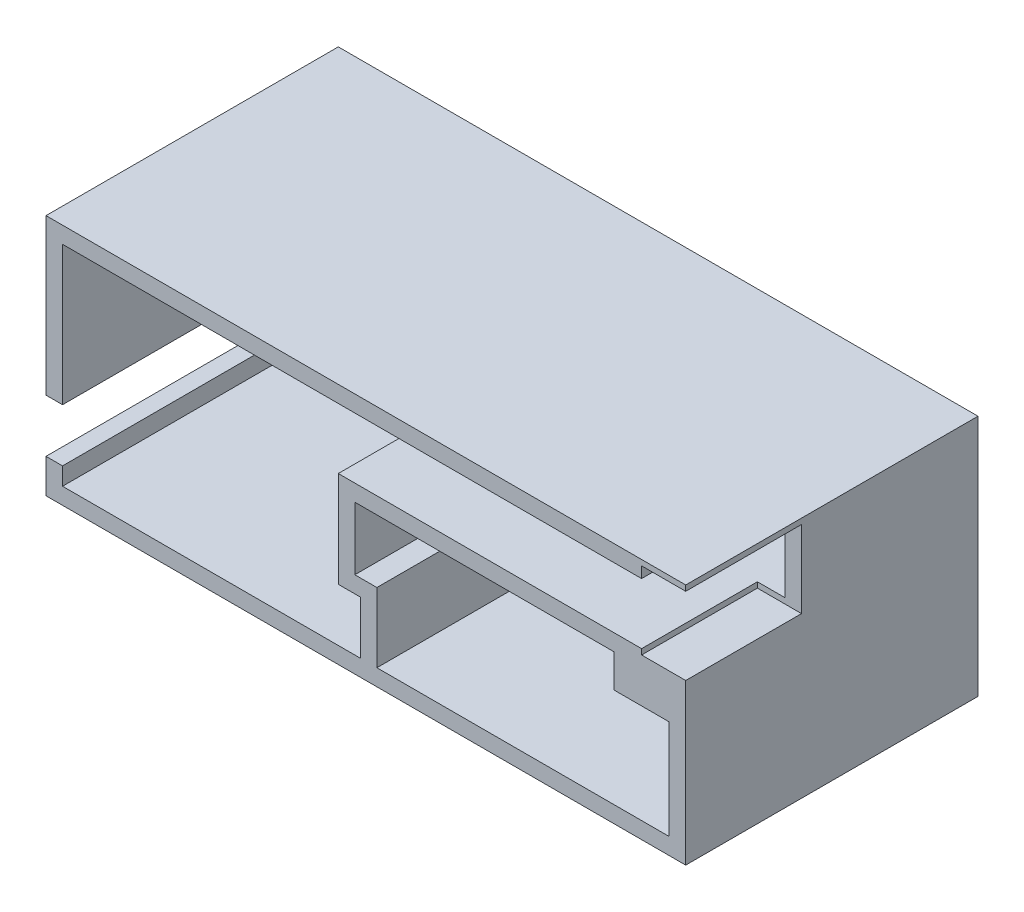
ISO-10303-21;
HEADER;
FILE_DESCRIPTION(('STEP AP214'),'2;1');
FILE_NAME('part.step','',(''),(''),'','','');
FILE_SCHEMA(('AUTOMOTIVE_DESIGN { 1 0 10303 214 1 1 1 1 }'));
ENDSEC;
DATA;
#1=APPLICATION_CONTEXT('core data for automotive mechanical design processes');
#2=APPLICATION_PROTOCOL_DEFINITION('international standard','automotive_design',2000,#1);
#3=PRODUCT_CONTEXT('',#1,'mechanical');
#4=PRODUCT('Part','Part','',(#3));
#5=PRODUCT_RELATED_PRODUCT_CATEGORY('part','',(#4));
#6=PRODUCT_DEFINITION_FORMATION('','',#4);
#7=PRODUCT_DEFINITION_CONTEXT('part definition',#1,'design');
#8=PRODUCT_DEFINITION('design','',#6,#7);
#9=PRODUCT_DEFINITION_SHAPE('','',#8);
#10=(LENGTH_UNIT() NAMED_UNIT(*) SI_UNIT(.MILLI.,.METRE.));
#11=(NAMED_UNIT(*) PLANE_ANGLE_UNIT() SI_UNIT($,.RADIAN.));
#12=(NAMED_UNIT(*) SI_UNIT($,.STERADIAN.) SOLID_ANGLE_UNIT());
#13=UNCERTAINTY_MEASURE_WITH_UNIT(LENGTH_MEASURE(1.E-05),#10,'distance_accuracy_value','');
#14=(GEOMETRIC_REPRESENTATION_CONTEXT(3) GLOBAL_UNCERTAINTY_ASSIGNED_CONTEXT((#13)) GLOBAL_UNIT_ASSIGNED_CONTEXT((#10,
#11,#12)) REPRESENTATION_CONTEXT('',''));
#15=CARTESIAN_POINT('',(0.,0.,0.));
#16=DIRECTION('',(0.,0.,1.));
#17=DIRECTION('',(1.,0.,0.));
#18=AXIS2_PLACEMENT_3D('',#15,#16,#17);
#19=CARTESIAN_POINT('',(0.,0.,26.5));
#20=DIRECTION('',(0.,0.,1.));
#21=DIRECTION('',(1.,0.,0.));
#22=AXIS2_PLACEMENT_3D('',#19,#20,#21);
#23=PLANE('',#22);
#24=DIRECTION('',(1.,0.,0.));
#25=VECTOR('',#24,1.);
#26=CARTESIAN_POINT('',(34.718487394958,21.5,26.5));
#27=LINE('',#26,#25);
#28=CARTESIAN_POINT('',(34.718487394958,21.5,26.5));
#29=VERTEX_POINT('',#28);
#30=CARTESIAN_POINT('',(38.718487394958,21.5,26.5));
#31=VERTEX_POINT('',#30);
#32=EDGE_CURVE('E269',#29,#31,#27,.T.);
#33=ORIENTED_EDGE('',*,*,#32,.T.);
#34=DIRECTION('',(0.,1.,0.));
#35=VECTOR('',#34,1.);
#36=CARTESIAN_POINT('',(38.718487394958,0.,26.5));
#37=LINE('',#36,#35);
#38=CARTESIAN_POINT('',(38.718487394958,22.,26.5));
#39=VERTEX_POINT('',#38);
#40=EDGE_CURVE('E412',#31,#39,#37,.T.);
#41=ORIENTED_EDGE('',*,*,#40,.T.);
#42=DIRECTION('',(-1.,0.,0.));
#43=VECTOR('',#42,1.);
#44=CARTESIAN_POINT('',(38.718487394958,22.,26.5));
#45=LINE('',#44,#43);
#46=CARTESIAN_POINT('',(-19.281512605042,22.,26.5));
#47=VERTEX_POINT('',#46);
#48=EDGE_CURVE('E403',#39,#47,#45,.T.);
#49=ORIENTED_EDGE('',*,*,#48,.T.);
#50=DIRECTION('',(0.,-1.,0.));
#51=VECTOR('',#50,1.);
#52=CARTESIAN_POINT('',(-19.281512605042,22.,26.5));
#53=LINE('',#52,#51);
#54=CARTESIAN_POINT('',(-19.281512605042,7.9,26.5));
#55=VERTEX_POINT('',#54);
#56=EDGE_CURVE('E407',#47,#55,#53,.T.);
#57=ORIENTED_EDGE('',*,*,#56,.T.);
#58=DIRECTION('',(-1.,0.,0.));
#59=VECTOR('',#58,1.);
#60=CARTESIAN_POINT('',(-14.281512605042,7.9,26.5));
#61=LINE('',#60,#59);
#62=CARTESIAN_POINT('',(-17.781512605042,7.9,26.5));
#63=VERTEX_POINT('',#62);
#64=EDGE_CURVE('E280',#63,#55,#61,.T.);
#65=ORIENTED_EDGE('',*,*,#64,.F.);
#66=DIRECTION('',(0.,-1.,0.));
#67=VECTOR('',#66,1.);
#68=CARTESIAN_POINT('',(-17.781512605042,20.5,26.5));
#69=LINE('',#68,#67);
#70=CARTESIAN_POINT('',(-17.781512605042,20.5,26.5));
#71=VERTEX_POINT('',#70);
#72=EDGE_CURVE('E351',#71,#63,#69,.T.);
#73=ORIENTED_EDGE('',*,*,#72,.F.);
#74=DIRECTION('',(-1.,0.,0.));
#75=VECTOR('',#74,1.);
#76=CARTESIAN_POINT('',(37.218487394958,20.5,26.5));
#77=LINE('',#76,#75);
#78=CARTESIAN_POINT('',(34.718487394958,20.5,26.5));
#79=VERTEX_POINT('',#78);
#80=EDGE_CURVE('E347',#79,#71,#77,.T.);
#81=ORIENTED_EDGE('',*,*,#80,.F.);
#82=DIRECTION('',(0.,-1.,0.));
#83=VECTOR('',#82,1.);
#84=CARTESIAN_POINT('',(34.718487394958,21.5,26.5));
#85=LINE('',#84,#83);
#86=EDGE_CURVE('E240',#29,#79,#85,.T.);
#87=ORIENTED_EDGE('',*,*,#86,.F.);
#88=EDGE_LOOP('',(#33,#41,#49,#57,#65,#73,#81,#87));
#89=FACE_BOUND('',#88,.T.);
#90=ADVANCED_FACE('F33',(#89),#23,.T.);
#91=CARTESIAN_POINT('',(-19.281512605042,0.,1.5));
#92=DIRECTION('',(1.,0.,0.));
#93=DIRECTION('',(0.,0.,-1.));
#94=AXIS2_PLACEMENT_3D('',#91,#92,#93);
#95=PLANE('',#94);
#96=CARTESIAN_POINT('',(-19.281512605042,3.1,26.5));
#97=VERTEX_POINT('',#96);
#98=CARTESIAN_POINT('',(-19.281512605042,0.,26.5));
#99=VERTEX_POINT('',#98);
#100=EDGE_CURVE('E406',#97,#99,#53,.T.);
#101=ORIENTED_EDGE('',*,*,#100,.F.);
#102=DIRECTION('',(0.,0.,1.));
#103=VECTOR('',#102,1.);
#104=CARTESIAN_POINT('',(-19.281512605042,3.1,19.25));
#105=LINE('',#104,#103);
#106=CARTESIAN_POINT('',(-19.281512605042,3.1,7.25));
#107=VERTEX_POINT('',#106);
#108=EDGE_CURVE('E278',#107,#97,#105,.T.);
#109=ORIENTED_EDGE('',*,*,#108,.F.);
#110=DIRECTION('',(0.,-1.,0.));
#111=VECTOR('',#110,1.);
#112=CARTESIAN_POINT('',(-19.281512605042,3.1,7.25));
#113=LINE('',#112,#111);
#114=CARTESIAN_POINT('',(-19.281512605042,7.9,7.25));
#115=VERTEX_POINT('',#114);
#116=EDGE_CURVE('E275',#115,#107,#113,.T.);
#117=ORIENTED_EDGE('',*,*,#116,.F.);
#118=DIRECTION('',(0.,0.,-1.));
#119=VECTOR('',#118,1.);
#120=CARTESIAN_POINT('',(-19.281512605042,7.9,7.25));
#121=LINE('',#120,#119);
#122=EDGE_CURVE('E273',#55,#115,#121,.T.);
#123=ORIENTED_EDGE('',*,*,#122,.F.);
#124=ORIENTED_EDGE('',*,*,#56,.F.);
#125=DIRECTION('',(0.,0.,-1.));
#126=VECTOR('',#125,1.);
#127=CARTESIAN_POINT('',(-19.281512605042,22.,1.5));
#128=LINE('',#127,#126);
#129=CARTESIAN_POINT('',(-19.281512605042,22.,0.));
#130=VERTEX_POINT('',#129);
#131=EDGE_CURVE('E423',#47,#130,#128,.T.);
#132=ORIENTED_EDGE('',*,*,#131,.T.);
#133=DIRECTION('',(0.,-1.,0.));
#134=VECTOR('',#133,1.);
#135=CARTESIAN_POINT('',(-19.281512605042,0.,0.));
#136=LINE('',#135,#134);
#137=CARTESIAN_POINT('',(-19.281512605042,0.,0.));
#138=VERTEX_POINT('',#137);
#139=EDGE_CURVE('E414',#130,#138,#136,.T.);
#140=ORIENTED_EDGE('',*,*,#139,.T.);
#141=DIRECTION('',(0.,0.,-1.));
#142=VECTOR('',#141,1.);
#143=CARTESIAN_POINT('',(-19.281512605042,0.,1.5));
#144=LINE('',#143,#142);
#145=EDGE_CURVE('E432',#99,#138,#144,.T.);
#146=ORIENTED_EDGE('',*,*,#145,.F.);
#147=EDGE_LOOP('',(#101,#109,#117,#123,#124,#132,#140,#146));
#148=FACE_BOUND('',#147,.T.);
#149=ADVANCED_FACE('F35',(#148),#95,.F.);
#150=CARTESIAN_POINT('',(-19.281512605042,0.,1.5));
#151=DIRECTION('',(0.,1.,0.));
#152=DIRECTION('',(0.,0.,1.));
#153=AXIS2_PLACEMENT_3D('',#150,#151,#152);
#154=PLANE('',#153);
#155=DIRECTION('',(1.,0.,0.));
#156=VECTOR('',#155,1.);
#157=CARTESIAN_POINT('',(-19.281512605042,0.,0.));
#158=LINE('',#157,#156);
#159=CARTESIAN_POINT('',(38.718487394958,0.,0.));
#160=VERTEX_POINT('',#159);
#161=EDGE_CURVE('E417',#138,#160,#158,.T.);
#162=ORIENTED_EDGE('',*,*,#161,.T.);
#163=DIRECTION('',(0.,0.,-1.));
#164=VECTOR('',#163,1.);
#165=CARTESIAN_POINT('',(38.718487394958,0.,1.5));
#166=LINE('',#165,#164);
#167=CARTESIAN_POINT('',(38.718487394958,0.,26.5));
#168=VERTEX_POINT('',#167);
#169=EDGE_CURVE('E429',#168,#160,#166,.T.);
#170=ORIENTED_EDGE('',*,*,#169,.F.);
#171=DIRECTION('',(1.,0.,0.));
#172=VECTOR('',#171,1.);
#173=CARTESIAN_POINT('',(-19.281512605042,0.,26.5));
#174=LINE('',#173,#172);
#175=EDGE_CURVE('E410',#99,#168,#174,.T.);
#176=ORIENTED_EDGE('',*,*,#175,.F.);
#177=ORIENTED_EDGE('',*,*,#145,.T.);
#178=EDGE_LOOP('',(#162,#170,#176,#177));
#179=FACE_BOUND('',#178,.T.);
#180=ADVANCED_FACE('F495',(#179),#154,.F.);
#181=CARTESIAN_POINT('',(38.718487394958,0.,1.5));
#182=DIRECTION('',(-1.,0.,0.));
#183=DIRECTION('',(0.,0.,1.));
#184=AXIS2_PLACEMENT_3D('',#181,#182,#183);
#185=PLANE('',#184);
#186=ORIENTED_EDGE('',*,*,#40,.F.);
#187=DIRECTION('',(0.,0.,1.));
#188=VECTOR('',#187,1.);
#189=CARTESIAN_POINT('',(38.718487394958,21.5,26.5));
#190=LINE('',#189,#188);
#191=CARTESIAN_POINT('',(38.718487394958,21.5,16.));
#192=VERTEX_POINT('',#191);
#193=EDGE_CURVE('E241',#192,#31,#190,.T.);
#194=ORIENTED_EDGE('',*,*,#193,.F.);
#195=DIRECTION('',(0.,1.,0.));
#196=VECTOR('',#195,1.);
#197=CARTESIAN_POINT('',(38.718487394958,21.5,16.));
#198=LINE('',#197,#196);
#199=CARTESIAN_POINT('',(38.718487394958,14.5,16.));
#200=VERTEX_POINT('',#199);
#201=EDGE_CURVE('E515',#200,#192,#198,.T.);
#202=ORIENTED_EDGE('',*,*,#201,.F.);
#203=DIRECTION('',(0.,0.,-1.));
#204=VECTOR('',#203,1.);
#205=CARTESIAN_POINT('',(38.718487394958,14.5,16.));
#206=LINE('',#205,#204);
#207=CARTESIAN_POINT('',(38.718487394958,14.5,26.5));
#208=VERTEX_POINT('',#207);
#209=EDGE_CURVE('E518',#208,#200,#206,.T.);
#210=ORIENTED_EDGE('',*,*,#209,.F.);
#211=EDGE_CURVE('E257',#168,#208,#37,.T.);
#212=ORIENTED_EDGE('',*,*,#211,.F.);
#213=ORIENTED_EDGE('',*,*,#169,.T.);
#214=DIRECTION('',(0.,1.,0.));
#215=VECTOR('',#214,1.);
#216=CARTESIAN_POINT('',(38.718487394958,0.,0.));
#217=LINE('',#216,#215);
#218=CARTESIAN_POINT('',(38.718487394958,22.,0.));
#219=VERTEX_POINT('',#218);
#220=EDGE_CURVE('E419',#160,#219,#217,.T.);
#221=ORIENTED_EDGE('',*,*,#220,.T.);
#222=DIRECTION('',(0.,0.,-1.));
#223=VECTOR('',#222,1.);
#224=CARTESIAN_POINT('',(38.718487394958,22.,1.5));
#225=LINE('',#224,#223);
#226=EDGE_CURVE('E426',#39,#219,#225,.T.);
#227=ORIENTED_EDGE('',*,*,#226,.F.);
#228=EDGE_LOOP('',(#186,#194,#202,#210,#212,#213,#221,#227));
#229=FACE_BOUND('',#228,.T.);
#230=ADVANCED_FACE('F499',(#229),#185,.F.);
#231=CARTESIAN_POINT('',(-19.281512605042,22.,1.5));
#232=DIRECTION('',(0.,-1.,0.));
#233=DIRECTION('',(0.,0.,-1.));
#234=AXIS2_PLACEMENT_3D('',#231,#232,#233);
#235=PLANE('',#234);
#236=DIRECTION('',(-1.,0.,0.));
#237=VECTOR('',#236,1.);
#238=CARTESIAN_POINT('',(-19.281512605042,22.,0.));
#239=LINE('',#238,#237);
#240=EDGE_CURVE('E421',#219,#130,#239,.T.);
#241=ORIENTED_EDGE('',*,*,#240,.T.);
#242=ORIENTED_EDGE('',*,*,#131,.F.);
#243=ORIENTED_EDGE('',*,*,#48,.F.);
#244=ORIENTED_EDGE('',*,*,#226,.T.);
#245=EDGE_LOOP('',(#241,#242,#243,#244));
#246=FACE_BOUND('',#245,.T.);
#247=ADVANCED_FACE('F505',(#246),#235,.F.);
#248=CARTESIAN_POINT('',(0.,0.,0.));
#249=DIRECTION('',(0.,0.,-1.));
#250=DIRECTION('',(-1.,0.,0.));
#251=AXIS2_PLACEMENT_3D('',#248,#249,#250);
#252=PLANE('',#251);
#253=ORIENTED_EDGE('',*,*,#139,.F.);
#254=ORIENTED_EDGE('',*,*,#240,.F.);
#255=ORIENTED_EDGE('',*,*,#220,.F.);
#256=ORIENTED_EDGE('',*,*,#161,.F.);
#257=EDGE_LOOP('',(#253,#254,#255,#256));
#258=FACE_BOUND('',#257,.T.);
#259=ADVANCED_FACE('F503',(#258),#252,.T.);
#260=DIRECTION('',(1.,0.,0.));
#261=VECTOR('',#260,1.);
#262=CARTESIAN_POINT('',(34.718487394958,14.5,26.5));
#263=LINE('',#262,#261);
#264=CARTESIAN_POINT('',(34.718487394958,14.5,26.5));
#265=VERTEX_POINT('',#264);
#266=EDGE_CURVE('E246',#265,#208,#263,.T.);
#267=ORIENTED_EDGE('',*,*,#266,.F.);
#268=CARTESIAN_POINT('',(34.718487394958,15.,26.5));
#269=VERTEX_POINT('',#268);
#270=EDGE_CURVE('E230',#269,#265,#85,.T.);
#271=ORIENTED_EDGE('',*,*,#270,.F.);
#272=DIRECTION('',(1.,0.,0.));
#273=VECTOR('',#272,1.);
#274=CARTESIAN_POINT('',(37.218487394958,15.,26.5));
#275=LINE('',#274,#273);
#276=CARTESIAN_POINT('',(7.21848739495798,15.,26.5));
#277=VERTEX_POINT('',#276);
#278=EDGE_CURVE('E362',#277,#269,#275,.T.);
#279=ORIENTED_EDGE('',*,*,#278,.F.);
#280=DIRECTION('',(0.,1.,0.));
#281=VECTOR('',#280,1.);
#282=CARTESIAN_POINT('',(7.21848739495798,15.,26.5));
#283=LINE('',#282,#281);
#284=CARTESIAN_POINT('',(7.21848739495798,6.3,26.5));
#285=VERTEX_POINT('',#284);
#286=EDGE_CURVE('E360',#285,#277,#283,.T.);
#287=ORIENTED_EDGE('',*,*,#286,.F.);
#288=DIRECTION('',(-1.,0.,0.));
#289=VECTOR('',#288,1.);
#290=CARTESIAN_POINT('',(7.21848739495798,6.3,26.5));
#291=LINE('',#290,#289);
#292=CARTESIAN_POINT('',(9.21848739495798,6.3,26.5));
#293=VERTEX_POINT('',#292);
#294=EDGE_CURVE('E358',#293,#285,#291,.T.);
#295=ORIENTED_EDGE('',*,*,#294,.F.);
#296=DIRECTION('',(0.,1.,0.));
#297=VECTOR('',#296,1.);
#298=CARTESIAN_POINT('',(9.21848739495798,6.3,26.5));
#299=LINE('',#298,#297);
#300=CARTESIAN_POINT('',(9.21848739495798,1.5,26.5));
#301=VERTEX_POINT('',#300);
#302=EDGE_CURVE('E356',#301,#293,#299,.T.);
#303=ORIENTED_EDGE('',*,*,#302,.F.);
#304=DIRECTION('',(1.,0.,0.));
#305=VECTOR('',#304,1.);
#306=CARTESIAN_POINT('',(-17.781512605042,1.5,26.5));
#307=LINE('',#306,#305);
#308=CARTESIAN_POINT('',(-17.781512605042,1.5,26.5));
#309=VERTEX_POINT('',#308);
#310=EDGE_CURVE('E354',#309,#301,#307,.T.);
#311=ORIENTED_EDGE('',*,*,#310,.F.);
#312=CARTESIAN_POINT('',(-17.781512605042,3.1,26.5));
#313=VERTEX_POINT('',#312);
#314=EDGE_CURVE('E349',#313,#309,#69,.T.);
#315=ORIENTED_EDGE('',*,*,#314,.F.);
#316=DIRECTION('',(-1.,0.,0.));
#317=VECTOR('',#316,1.);
#318=CARTESIAN_POINT('',(-14.281512605042,3.1,26.5));
#319=LINE('',#318,#317);
#320=EDGE_CURVE('E283',#313,#97,#319,.T.);
#321=ORIENTED_EDGE('',*,*,#320,.T.);
#322=ORIENTED_EDGE('',*,*,#100,.T.);
#323=ORIENTED_EDGE('',*,*,#175,.T.);
#324=ORIENTED_EDGE('',*,*,#211,.T.);
#325=EDGE_LOOP('',(#267,#271,#279,#287,#295,#303,#311,#315,#321,#322,#323,#324));
#326=FACE_BOUND('',#325,.T.);
#327=DIRECTION('',(0.,1.,0.));
#328=VECTOR('',#327,1.);
#329=CARTESIAN_POINT('',(37.218487394958,1.5,26.5));
#330=LINE('',#329,#328);
#331=CARTESIAN_POINT('',(37.218487394958,1.5,26.5));
#332=VERTEX_POINT('',#331);
#333=CARTESIAN_POINT('',(37.218487394958,10.5,26.5));
#334=VERTEX_POINT('',#333);
#335=EDGE_CURVE('E291',#332,#334,#330,.T.);
#336=ORIENTED_EDGE('',*,*,#335,.F.);
#337=DIRECTION('',(1.,0.,0.));
#338=VECTOR('',#337,1.);
#339=CARTESIAN_POINT('',(10.718487394958,1.5,26.5));
#340=LINE('',#339,#338);
#341=CARTESIAN_POINT('',(10.718487394958,1.5,26.5));
#342=VERTEX_POINT('',#341);
#343=EDGE_CURVE('E289',#342,#332,#340,.T.);
#344=ORIENTED_EDGE('',*,*,#343,.F.);
#345=DIRECTION('',(0.,-1.,0.));
#346=VECTOR('',#345,1.);
#347=CARTESIAN_POINT('',(10.718487394958,7.8,26.5));
#348=LINE('',#347,#346);
#349=CARTESIAN_POINT('',(10.718487394958,7.8,26.5));
#350=VERTEX_POINT('',#349);
#351=EDGE_CURVE('E305',#350,#342,#348,.T.);
#352=ORIENTED_EDGE('',*,*,#351,.F.);
#353=DIRECTION('',(1.,0.,0.));
#354=VECTOR('',#353,1.);
#355=CARTESIAN_POINT('',(8.71848739495798,7.8,26.5));
#356=LINE('',#355,#354);
#357=CARTESIAN_POINT('',(8.71848739495798,7.8,26.5));
#358=VERTEX_POINT('',#357);
#359=EDGE_CURVE('E302',#358,#350,#356,.T.);
#360=ORIENTED_EDGE('',*,*,#359,.F.);
#361=DIRECTION('',(0.,-1.,0.));
#362=VECTOR('',#361,1.);
#363=CARTESIAN_POINT('',(8.71848739495798,13.5,26.5));
#364=LINE('',#363,#362);
#365=CARTESIAN_POINT('',(8.71848739495798,13.5,26.5));
#366=VERTEX_POINT('',#365);
#367=EDGE_CURVE('E300',#366,#358,#364,.T.);
#368=ORIENTED_EDGE('',*,*,#367,.F.);
#369=DIRECTION('',(-1.,0.,0.));
#370=VECTOR('',#369,1.);
#371=CARTESIAN_POINT('',(32.218487394958,13.5,26.5));
#372=LINE('',#371,#370);
#373=CARTESIAN_POINT('',(32.218487394958,13.5,26.5));
#374=VERTEX_POINT('',#373);
#375=EDGE_CURVE('E298',#374,#366,#372,.T.);
#376=ORIENTED_EDGE('',*,*,#375,.F.);
#377=DIRECTION('',(0.,1.,0.));
#378=VECTOR('',#377,1.);
#379=CARTESIAN_POINT('',(32.218487394958,13.5,26.5));
#380=LINE('',#379,#378);
#381=CARTESIAN_POINT('',(32.218487394958,10.5,26.5));
#382=VERTEX_POINT('',#381);
#383=EDGE_CURVE('E296',#382,#374,#380,.T.);
#384=ORIENTED_EDGE('',*,*,#383,.F.);
#385=DIRECTION('',(-1.,0.,0.));
#386=VECTOR('',#385,1.);
#387=CARTESIAN_POINT('',(32.218487394958,10.5,26.5));
#388=LINE('',#387,#386);
#389=EDGE_CURVE('E294',#334,#382,#388,.T.);
#390=ORIENTED_EDGE('',*,*,#389,.F.);
#391=EDGE_LOOP('',(#336,#344,#352,#360,#368,#376,#384,#390));
#392=FACE_BOUND('',#391,.T.);
#393=ADVANCED_FACE('F253',(#326,#392),#23,.T.);
#394=CARTESIAN_POINT('',(37.218487394958,20.5,26.5));
#395=DIRECTION('',(0.,-1.,0.));
#396=DIRECTION('',(0.,0.,-1.));
#397=AXIS2_PLACEMENT_3D('',#394,#395,#396);
#398=PLANE('',#397);
#399=DIRECTION('',(1.,0.,0.));
#400=VECTOR('',#399,1.);
#401=CARTESIAN_POINT('',(37.218487394958,20.5,16.));
#402=LINE('',#401,#400);
#403=CARTESIAN_POINT('',(34.718487394958,20.5,16.));
#404=VERTEX_POINT('',#403);
#405=CARTESIAN_POINT('',(37.218487394958,20.5,16.));
#406=VERTEX_POINT('',#405);
#407=EDGE_CURVE('E48',#404,#406,#402,.T.);
#408=ORIENTED_EDGE('',*,*,#407,.F.);
#409=DIRECTION('',(0.,0.,-1.));
#410=VECTOR('',#409,1.);
#411=CARTESIAN_POINT('',(34.718487394958,20.5,26.5));
#412=LINE('',#411,#410);
#413=EDGE_CURVE('E271',#79,#404,#412,.T.);
#414=ORIENTED_EDGE('',*,*,#413,.F.);
#415=ORIENTED_EDGE('',*,*,#80,.T.);
#416=DIRECTION('',(0.,0.,-1.));
#417=VECTOR('',#416,1.);
#418=CARTESIAN_POINT('',(-17.781512605042,20.5,26.5));
#419=LINE('',#418,#417);
#420=CARTESIAN_POINT('',(-17.781512605042,20.5,1.5));
#421=VERTEX_POINT('',#420);
#422=EDGE_CURVE('E400',#71,#421,#419,.T.);
#423=ORIENTED_EDGE('',*,*,#422,.T.);
#424=DIRECTION('',(-1.,0.,0.));
#425=VECTOR('',#424,1.);
#426=CARTESIAN_POINT('',(37.218487394958,20.5,1.5));
#427=LINE('',#426,#425);
#428=CARTESIAN_POINT('',(37.218487394958,20.5,1.5));
#429=VERTEX_POINT('',#428);
#430=EDGE_CURVE('E346',#429,#421,#427,.T.);
#431=ORIENTED_EDGE('',*,*,#430,.F.);
#432=DIRECTION('',(0.,0.,-1.));
#433=VECTOR('',#432,1.);
#434=CARTESIAN_POINT('',(37.218487394958,20.5,26.5));
#435=LINE('',#434,#433);
#436=EDGE_CURVE('E364',#406,#429,#435,.T.);
#437=ORIENTED_EDGE('',*,*,#436,.F.);
#438=EDGE_LOOP('',(#408,#414,#415,#423,#431,#437));
#439=FACE_BOUND('',#438,.T.);
#440=ADVANCED_FACE('F531',(#439),#398,.T.);
#441=CARTESIAN_POINT('',(-17.781512605042,20.5,26.5));
#442=DIRECTION('',(1.,0.,0.));
#443=DIRECTION('',(0.,0.,-1.));
#444=AXIS2_PLACEMENT_3D('',#441,#442,#443);
#445=PLANE('',#444);
#446=DIRECTION('',(0.,0.,-1.));
#447=VECTOR('',#446,1.);
#448=CARTESIAN_POINT('',(-17.781512605042,3.1,26.5));
#449=LINE('',#448,#447);
#450=CARTESIAN_POINT('',(-17.781512605042,3.1,7.25));
#451=VERTEX_POINT('',#450);
#452=EDGE_CURVE('E439',#313,#451,#449,.T.);
#453=ORIENTED_EDGE('',*,*,#452,.F.);
#454=ORIENTED_EDGE('',*,*,#314,.T.);
#455=DIRECTION('',(0.,0.,-1.));
#456=VECTOR('',#455,1.);
#457=CARTESIAN_POINT('',(-17.781512605042,1.5,26.5));
#458=LINE('',#457,#456);
#459=CARTESIAN_POINT('',(-17.781512605042,1.5,1.5));
#460=VERTEX_POINT('',#459);
#461=EDGE_CURVE('E398',#309,#460,#458,.T.);
#462=ORIENTED_EDGE('',*,*,#461,.T.);
#463=DIRECTION('',(0.,-1.,0.));
#464=VECTOR('',#463,1.);
#465=CARTESIAN_POINT('',(-17.781512605042,20.5,1.5));
#466=LINE('',#465,#464);
#467=EDGE_CURVE('E367',#421,#460,#466,.T.);
#468=ORIENTED_EDGE('',*,*,#467,.F.);
#469=ORIENTED_EDGE('',*,*,#422,.F.);
#470=ORIENTED_EDGE('',*,*,#72,.T.);
#471=DIRECTION('',(0.,0.,1.));
#472=VECTOR('',#471,1.);
#473=CARTESIAN_POINT('',(-17.781512605042,7.9,26.5));
#474=LINE('',#473,#472);
#475=CARTESIAN_POINT('',(-17.781512605042,7.9,7.25000000000001));
#476=VERTEX_POINT('',#475);
#477=EDGE_CURVE('E435',#476,#63,#474,.T.);
#478=ORIENTED_EDGE('',*,*,#477,.F.);
#479=DIRECTION('',(0.,1.,0.));
#480=VECTOR('',#479,1.);
#481=CARTESIAN_POINT('',(-17.781512605042,20.5,7.25000000000001));
#482=LINE('',#481,#480);
#483=EDGE_CURVE('E437',#451,#476,#482,.T.);
#484=ORIENTED_EDGE('',*,*,#483,.F.);
#485=EDGE_LOOP('',(#453,#454,#462,#468,#469,#470,#478,#484));
#486=FACE_BOUND('',#485,.T.);
#487=ADVANCED_FACE('F477',(#486),#445,.T.);
#488=CARTESIAN_POINT('',(-17.781512605042,1.5,26.5));
#489=DIRECTION('',(0.,1.,0.));
#490=DIRECTION('',(-1.,0.,0.));
#491=AXIS2_PLACEMENT_3D('',#488,#489,#490);
#492=PLANE('',#491);
#493=DIRECTION('',(1.,0.,0.));
#494=VECTOR('',#493,1.);
#495=CARTESIAN_POINT('',(-17.781512605042,1.5,1.5));
#496=LINE('',#495,#494);
#497=CARTESIAN_POINT('',(9.21848739495798,1.5,1.5));
#498=VERTEX_POINT('',#497);
#499=EDGE_CURVE('E370',#460,#498,#496,.T.);
#500=ORIENTED_EDGE('',*,*,#499,.F.);
#501=ORIENTED_EDGE('',*,*,#461,.F.);
#502=ORIENTED_EDGE('',*,*,#310,.T.);
#503=DIRECTION('',(0.,0.,-1.));
#504=VECTOR('',#503,1.);
#505=CARTESIAN_POINT('',(9.21848739495798,1.5,26.5));
#506=LINE('',#505,#504);
#507=EDGE_CURVE('E396',#301,#498,#506,.T.);
#508=ORIENTED_EDGE('',*,*,#507,.T.);
#509=EDGE_LOOP('',(#500,#501,#502,#508));
#510=FACE_BOUND('',#509,.T.);
#511=ADVANCED_FACE('F474',(#510),#492,.T.);
#512=CARTESIAN_POINT('',(9.21848739495798,6.3,26.5));
#513=DIRECTION('',(-1.,0.,0.));
#514=DIRECTION('',(0.,-1.,0.));
#515=AXIS2_PLACEMENT_3D('',#512,#513,#514);
#516=PLANE('',#515);
#517=DIRECTION('',(0.,1.,0.));
#518=VECTOR('',#517,1.);
#519=CARTESIAN_POINT('',(9.21848739495798,6.3,1.5));
#520=LINE('',#519,#518);
#521=CARTESIAN_POINT('',(9.21848739495798,6.3,1.5));
#522=VERTEX_POINT('',#521);
#523=EDGE_CURVE('E373',#498,#522,#520,.T.);
#524=ORIENTED_EDGE('',*,*,#523,.F.);
#525=ORIENTED_EDGE('',*,*,#507,.F.);
#526=ORIENTED_EDGE('',*,*,#302,.T.);
#527=DIRECTION('',(0.,0.,-1.));
#528=VECTOR('',#527,1.);
#529=CARTESIAN_POINT('',(9.21848739495798,6.3,26.5));
#530=LINE('',#529,#528);
#531=EDGE_CURVE('E394',#293,#522,#530,.T.);
#532=ORIENTED_EDGE('',*,*,#531,.T.);
#533=EDGE_LOOP('',(#524,#525,#526,#532));
#534=FACE_BOUND('',#533,.T.);
#535=ADVANCED_FACE('F467',(#534),#516,.T.);
#536=CARTESIAN_POINT('',(7.21848739495798,6.3,26.5));
#537=DIRECTION('',(0.,-1.,0.));
#538=DIRECTION('',(0.,0.,-1.));
#539=AXIS2_PLACEMENT_3D('',#536,#537,#538);
#540=PLANE('',#539);
#541=DIRECTION('',(-1.,0.,0.));
#542=VECTOR('',#541,1.);
#543=CARTESIAN_POINT('',(7.21848739495798,6.3,1.5));
#544=LINE('',#543,#542);
#545=CARTESIAN_POINT('',(7.21848739495798,6.3,1.5));
#546=VERTEX_POINT('',#545);
#547=EDGE_CURVE('E376',#522,#546,#544,.T.);
#548=ORIENTED_EDGE('',*,*,#547,.F.);
#549=ORIENTED_EDGE('',*,*,#531,.F.);
#550=ORIENTED_EDGE('',*,*,#294,.T.);
#551=DIRECTION('',(0.,0.,-1.));
#552=VECTOR('',#551,1.);
#553=CARTESIAN_POINT('',(7.21848739495798,6.3,26.5));
#554=LINE('',#553,#552);
#555=EDGE_CURVE('E392',#285,#546,#554,.T.);
#556=ORIENTED_EDGE('',*,*,#555,.T.);
#557=EDGE_LOOP('',(#548,#549,#550,#556));
#558=FACE_BOUND('',#557,.T.);
#559=ADVANCED_FACE('F463',(#558),#540,.T.);
#560=CARTESIAN_POINT('',(7.21848739495798,15.,26.5));
#561=DIRECTION('',(-1.,0.,0.));
#562=DIRECTION('',(0.,-1.,0.));
#563=AXIS2_PLACEMENT_3D('',#560,#561,#562);
#564=PLANE('',#563);
#565=DIRECTION('',(0.,1.,0.));
#566=VECTOR('',#565,1.);
#567=CARTESIAN_POINT('',(7.21848739495798,15.,1.5));
#568=LINE('',#567,#566);
#569=CARTESIAN_POINT('',(7.21848739495798,15.,1.5));
#570=VERTEX_POINT('',#569);
#571=EDGE_CURVE('E379',#546,#570,#568,.T.);
#572=ORIENTED_EDGE('',*,*,#571,.F.);
#573=ORIENTED_EDGE('',*,*,#555,.F.);
#574=ORIENTED_EDGE('',*,*,#286,.T.);
#575=DIRECTION('',(0.,0.,-1.));
#576=VECTOR('',#575,1.);
#577=CARTESIAN_POINT('',(7.21848739495798,15.,26.5));
#578=LINE('',#577,#576);
#579=EDGE_CURVE('E390',#277,#570,#578,.T.);
#580=ORIENTED_EDGE('',*,*,#579,.T.);
#581=EDGE_LOOP('',(#572,#573,#574,#580));
#582=FACE_BOUND('',#581,.T.);
#583=ADVANCED_FACE('F460',(#582),#564,.T.);
#584=CARTESIAN_POINT('',(37.218487394958,15.,26.5));
#585=DIRECTION('',(0.,1.,0.));
#586=DIRECTION('',(0.,0.,1.));
#587=AXIS2_PLACEMENT_3D('',#584,#585,#586);
#588=PLANE('',#587);
#589=DIRECTION('',(-1.,0.,0.));
#590=VECTOR('',#589,1.);
#591=CARTESIAN_POINT('',(37.218487394958,15.,16.));
#592=LINE('',#591,#590);
#593=CARTESIAN_POINT('',(37.218487394958,15.,16.));
#594=VERTEX_POINT('',#593);
#595=CARTESIAN_POINT('',(34.718487394958,15.,16.));
#596=VERTEX_POINT('',#595);
#597=EDGE_CURVE('E267',#594,#596,#592,.T.);
#598=ORIENTED_EDGE('',*,*,#597,.F.);
#599=DIRECTION('',(0.,0.,-1.));
#600=VECTOR('',#599,1.);
#601=CARTESIAN_POINT('',(37.218487394958,15.,26.5));
#602=LINE('',#601,#600);
#603=CARTESIAN_POINT('',(37.218487394958,15.,1.5));
#604=VERTEX_POINT('',#603);
#605=EDGE_CURVE('E388',#594,#604,#602,.T.);
#606=ORIENTED_EDGE('',*,*,#605,.T.);
#607=DIRECTION('',(1.,0.,0.));
#608=VECTOR('',#607,1.);
#609=CARTESIAN_POINT('',(37.218487394958,15.,1.5));
#610=LINE('',#609,#608);
#611=EDGE_CURVE('E382',#570,#604,#610,.T.);
#612=ORIENTED_EDGE('',*,*,#611,.F.);
#613=ORIENTED_EDGE('',*,*,#579,.F.);
#614=ORIENTED_EDGE('',*,*,#278,.T.);
#615=DIRECTION('',(0.,0.,1.));
#616=VECTOR('',#615,1.);
#617=CARTESIAN_POINT('',(34.718487394958,15.,26.5));
#618=LINE('',#617,#616);
#619=EDGE_CURVE('E11',#596,#269,#618,.T.);
#620=ORIENTED_EDGE('',*,*,#619,.F.);
#621=EDGE_LOOP('',(#598,#606,#612,#613,#614,#620));
#622=FACE_BOUND('',#621,.T.);
#623=ADVANCED_FACE('F446',(#622),#588,.T.);
#624=CARTESIAN_POINT('',(37.218487394958,15.,26.5));
#625=DIRECTION('',(-1.,0.,0.));
#626=DIRECTION('',(0.,-1.,0.));
#627=AXIS2_PLACEMENT_3D('',#624,#625,#626);
#628=PLANE('',#627);
#629=DIRECTION('',(0.,-1.,0.));
#630=VECTOR('',#629,1.);
#631=CARTESIAN_POINT('',(37.218487394958,15.,16.));
#632=LINE('',#631,#630);
#633=EDGE_CURVE('E41',#406,#594,#632,.T.);
#634=ORIENTED_EDGE('',*,*,#633,.F.);
#635=ORIENTED_EDGE('',*,*,#436,.T.);
#636=DIRECTION('',(0.,1.,0.));
#637=VECTOR('',#636,1.);
#638=CARTESIAN_POINT('',(37.218487394958,15.,1.5));
#639=LINE('',#638,#637);
#640=EDGE_CURVE('E350',#604,#429,#639,.T.);
#641=ORIENTED_EDGE('',*,*,#640,.F.);
#642=ORIENTED_EDGE('',*,*,#605,.F.);
#643=EDGE_LOOP('',(#634,#635,#641,#642));
#644=FACE_BOUND('',#643,.T.);
#645=ADVANCED_FACE('F449',(#644),#628,.T.);
#646=CARTESIAN_POINT('',(10.718487394958,1.5,26.5));
#647=DIRECTION('',(0.,1.,0.));
#648=DIRECTION('',(-1.,0.,0.));
#649=AXIS2_PLACEMENT_3D('',#646,#647,#648);
#650=PLANE('',#649);
#651=DIRECTION('',(1.,0.,0.));
#652=VECTOR('',#651,1.);
#653=CARTESIAN_POINT('',(10.718487394958,1.5,1.5));
#654=LINE('',#653,#652);
#655=CARTESIAN_POINT('',(10.718487394958,1.5,1.5));
#656=VERTEX_POINT('',#655);
#657=CARTESIAN_POINT('',(37.218487394958,1.5,1.5));
#658=VERTEX_POINT('',#657);
#659=EDGE_CURVE('E282',#656,#658,#654,.T.);
#660=ORIENTED_EDGE('',*,*,#659,.F.);
#661=DIRECTION('',(0.,0.,-1.));
#662=VECTOR('',#661,1.);
#663=CARTESIAN_POINT('',(10.718487394958,1.5,26.5));
#664=LINE('',#663,#662);
#665=EDGE_CURVE('E307',#342,#656,#664,.T.);
#666=ORIENTED_EDGE('',*,*,#665,.F.);
#667=ORIENTED_EDGE('',*,*,#343,.T.);
#668=DIRECTION('',(0.,0.,-1.));
#669=VECTOR('',#668,1.);
#670=CARTESIAN_POINT('',(37.218487394958,1.5,26.5));
#671=LINE('',#670,#669);
#672=EDGE_CURVE('E343',#332,#658,#671,.T.);
#673=ORIENTED_EDGE('',*,*,#672,.T.);
#674=EDGE_LOOP('',(#660,#666,#667,#673));
#675=FACE_BOUND('',#674,.T.);
#676=ADVANCED_FACE('F619',(#675),#650,.T.);
#677=CARTESIAN_POINT('',(37.218487394958,1.5,26.5));
#678=DIRECTION('',(-1.,0.,0.));
#679=DIRECTION('',(0.,0.,1.));
#680=AXIS2_PLACEMENT_3D('',#677,#678,#679);
#681=PLANE('',#680);
#682=DIRECTION('',(0.,1.,0.));
#683=VECTOR('',#682,1.);
#684=CARTESIAN_POINT('',(37.218487394958,1.5,1.5));
#685=LINE('',#684,#683);
#686=CARTESIAN_POINT('',(37.218487394958,10.5,1.5));
#687=VERTEX_POINT('',#686);
#688=EDGE_CURVE('E310',#658,#687,#685,.T.);
#689=ORIENTED_EDGE('',*,*,#688,.F.);
#690=ORIENTED_EDGE('',*,*,#672,.F.);
#691=ORIENTED_EDGE('',*,*,#335,.T.);
#692=DIRECTION('',(0.,0.,-1.));
#693=VECTOR('',#692,1.);
#694=CARTESIAN_POINT('',(37.218487394958,10.5,26.5));
#695=LINE('',#694,#693);
#696=EDGE_CURVE('E341',#334,#687,#695,.T.);
#697=ORIENTED_EDGE('',*,*,#696,.T.);
#698=EDGE_LOOP('',(#689,#690,#691,#697));
#699=FACE_BOUND('',#698,.T.);
#700=ADVANCED_FACE('F624',(#699),#681,.T.);
#701=CARTESIAN_POINT('',(32.218487394958,10.5,26.5));
#702=DIRECTION('',(0.,-1.,0.));
#703=DIRECTION('',(0.,0.,-1.));
#704=AXIS2_PLACEMENT_3D('',#701,#702,#703);
#705=PLANE('',#704);
#706=DIRECTION('',(-1.,0.,0.));
#707=VECTOR('',#706,1.);
#708=CARTESIAN_POINT('',(32.218487394958,10.5,1.5));
#709=LINE('',#708,#707);
#710=CARTESIAN_POINT('',(32.218487394958,10.5,1.5));
#711=VERTEX_POINT('',#710);
#712=EDGE_CURVE('E313',#687,#711,#709,.T.);
#713=ORIENTED_EDGE('',*,*,#712,.F.);
#714=ORIENTED_EDGE('',*,*,#696,.F.);
#715=ORIENTED_EDGE('',*,*,#389,.T.);
#716=DIRECTION('',(0.,0.,-1.));
#717=VECTOR('',#716,1.);
#718=CARTESIAN_POINT('',(32.218487394958,10.5,26.5));
#719=LINE('',#718,#717);
#720=EDGE_CURVE('E339',#382,#711,#719,.T.);
#721=ORIENTED_EDGE('',*,*,#720,.T.);
#722=EDGE_LOOP('',(#713,#714,#715,#721));
#723=FACE_BOUND('',#722,.T.);
#724=ADVANCED_FACE('F636',(#723),#705,.T.);
#725=CARTESIAN_POINT('',(32.218487394958,13.5,26.5));
#726=DIRECTION('',(-1.,0.,0.));
#727=DIRECTION('',(0.,0.,1.));
#728=AXIS2_PLACEMENT_3D('',#725,#726,#727);
#729=PLANE('',#728);
#730=DIRECTION('',(0.,1.,0.));
#731=VECTOR('',#730,1.);
#732=CARTESIAN_POINT('',(32.218487394958,13.5,1.5));
#733=LINE('',#732,#731);
#734=CARTESIAN_POINT('',(32.218487394958,13.5,1.5));
#735=VERTEX_POINT('',#734);
#736=EDGE_CURVE('E316',#711,#735,#733,.T.);
#737=ORIENTED_EDGE('',*,*,#736,.F.);
#738=ORIENTED_EDGE('',*,*,#720,.F.);
#739=ORIENTED_EDGE('',*,*,#383,.T.);
#740=DIRECTION('',(0.,0.,-1.));
#741=VECTOR('',#740,1.);
#742=CARTESIAN_POINT('',(32.218487394958,13.5,26.5));
#743=LINE('',#742,#741);
#744=EDGE_CURVE('E337',#374,#735,#743,.T.);
#745=ORIENTED_EDGE('',*,*,#744,.T.);
#746=EDGE_LOOP('',(#737,#738,#739,#745));
#747=FACE_BOUND('',#746,.T.);
#748=ADVANCED_FACE('F646',(#747),#729,.T.);
#749=CARTESIAN_POINT('',(32.218487394958,13.5,26.5));
#750=DIRECTION('',(0.,-1.,0.));
#751=DIRECTION('',(1.,0.,0.));
#752=AXIS2_PLACEMENT_3D('',#749,#750,#751);
#753=PLANE('',#752);
#754=DIRECTION('',(-1.,0.,0.));
#755=VECTOR('',#754,1.);
#756=CARTESIAN_POINT('',(32.218487394958,13.5,1.5));
#757=LINE('',#756,#755);
#758=CARTESIAN_POINT('',(8.71848739495798,13.5,1.5));
#759=VERTEX_POINT('',#758);
#760=EDGE_CURVE('E319',#735,#759,#757,.T.);
#761=ORIENTED_EDGE('',*,*,#760,.F.);
#762=ORIENTED_EDGE('',*,*,#744,.F.);
#763=ORIENTED_EDGE('',*,*,#375,.T.);
#764=DIRECTION('',(0.,0.,-1.));
#765=VECTOR('',#764,1.);
#766=CARTESIAN_POINT('',(8.71848739495798,13.5,26.5));
#767=LINE('',#766,#765);
#768=EDGE_CURVE('E335',#366,#759,#767,.T.);
#769=ORIENTED_EDGE('',*,*,#768,.T.);
#770=EDGE_LOOP('',(#761,#762,#763,#769));
#771=FACE_BOUND('',#770,.T.);
#772=ADVANCED_FACE('F656',(#771),#753,.T.);
#773=CARTESIAN_POINT('',(8.71848739495798,13.5,26.5));
#774=DIRECTION('',(1.,0.,0.));
#775=DIRECTION('',(0.,0.,-1.));
#776=AXIS2_PLACEMENT_3D('',#773,#774,#775);
#777=PLANE('',#776);
#778=DIRECTION('',(0.,-1.,0.));
#779=VECTOR('',#778,1.);
#780=CARTESIAN_POINT('',(8.71848739495798,13.5,1.5));
#781=LINE('',#780,#779);
#782=CARTESIAN_POINT('',(8.71848739495798,7.8,1.5));
#783=VERTEX_POINT('',#782);
#784=EDGE_CURVE('E322',#759,#783,#781,.T.);
#785=ORIENTED_EDGE('',*,*,#784,.F.);
#786=ORIENTED_EDGE('',*,*,#768,.F.);
#787=ORIENTED_EDGE('',*,*,#367,.T.);
#788=DIRECTION('',(0.,0.,-1.));
#789=VECTOR('',#788,1.);
#790=CARTESIAN_POINT('',(8.71848739495798,7.8,26.5));
#791=LINE('',#790,#789);
#792=EDGE_CURVE('E333',#358,#783,#791,.T.);
#793=ORIENTED_EDGE('',*,*,#792,.T.);
#794=EDGE_LOOP('',(#785,#786,#787,#793));
#795=FACE_BOUND('',#794,.T.);
#796=ADVANCED_FACE('F666',(#795),#777,.T.);
#797=CARTESIAN_POINT('',(8.71848739495798,7.8,26.5));
#798=DIRECTION('',(0.,1.,0.));
#799=DIRECTION('',(0.,0.,1.));
#800=AXIS2_PLACEMENT_3D('',#797,#798,#799);
#801=PLANE('',#800);
#802=DIRECTION('',(1.,0.,0.));
#803=VECTOR('',#802,1.);
#804=CARTESIAN_POINT('',(8.71848739495798,7.8,1.5));
#805=LINE('',#804,#803);
#806=CARTESIAN_POINT('',(10.718487394958,7.8,1.5));
#807=VERTEX_POINT('',#806);
#808=EDGE_CURVE('E325',#783,#807,#805,.T.);
#809=ORIENTED_EDGE('',*,*,#808,.F.);
#810=ORIENTED_EDGE('',*,*,#792,.F.);
#811=ORIENTED_EDGE('',*,*,#359,.T.);
#812=DIRECTION('',(0.,0.,-1.));
#813=VECTOR('',#812,1.);
#814=CARTESIAN_POINT('',(10.718487394958,7.8,26.5));
#815=LINE('',#814,#813);
#816=EDGE_CURVE('E331',#350,#807,#815,.T.);
#817=ORIENTED_EDGE('',*,*,#816,.T.);
#818=EDGE_LOOP('',(#809,#810,#811,#817));
#819=FACE_BOUND('',#818,.T.);
#820=ADVANCED_FACE('F676',(#819),#801,.T.);
#821=CARTESIAN_POINT('',(10.718487394958,7.8,26.5));
#822=DIRECTION('',(1.,0.,0.));
#823=DIRECTION('',(0.,1.,0.));
#824=AXIS2_PLACEMENT_3D('',#821,#822,#823);
#825=PLANE('',#824);
#826=DIRECTION('',(0.,-1.,0.));
#827=VECTOR('',#826,1.);
#828=CARTESIAN_POINT('',(10.718487394958,7.8,1.5));
#829=LINE('',#828,#827);
#830=EDGE_CURVE('E292',#807,#656,#829,.T.);
#831=ORIENTED_EDGE('',*,*,#830,.F.);
#832=ORIENTED_EDGE('',*,*,#816,.F.);
#833=ORIENTED_EDGE('',*,*,#351,.T.);
#834=ORIENTED_EDGE('',*,*,#665,.T.);
#835=EDGE_LOOP('',(#831,#832,#833,#834));
#836=FACE_BOUND('',#835,.T.);
#837=ADVANCED_FACE('F686',(#836),#825,.T.);
#838=CARTESIAN_POINT('',(0.,0.,1.5));
#839=DIRECTION('',(0.,0.,-1.));
#840=DIRECTION('',(-1.,0.,0.));
#841=AXIS2_PLACEMENT_3D('',#838,#839,#840);
#842=PLANE('',#841);
#843=ORIENTED_EDGE('',*,*,#640,.T.);
#844=ORIENTED_EDGE('',*,*,#430,.T.);
#845=ORIENTED_EDGE('',*,*,#467,.T.);
#846=ORIENTED_EDGE('',*,*,#499,.T.);
#847=ORIENTED_EDGE('',*,*,#523,.T.);
#848=ORIENTED_EDGE('',*,*,#547,.T.);
#849=ORIENTED_EDGE('',*,*,#571,.T.);
#850=ORIENTED_EDGE('',*,*,#611,.T.);
#851=EDGE_LOOP('',(#843,#844,#845,#846,#847,#848,#849,#850));
#852=FACE_BOUND('',#851,.T.);
#853=ADVANCED_FACE('F452',(#852),#842,.F.);
#854=ORIENTED_EDGE('',*,*,#830,.T.);
#855=ORIENTED_EDGE('',*,*,#659,.T.);
#856=ORIENTED_EDGE('',*,*,#688,.T.);
#857=ORIENTED_EDGE('',*,*,#712,.T.);
#858=ORIENTED_EDGE('',*,*,#736,.T.);
#859=ORIENTED_EDGE('',*,*,#760,.T.);
#860=ORIENTED_EDGE('',*,*,#784,.T.);
#861=ORIENTED_EDGE('',*,*,#808,.T.);
#862=EDGE_LOOP('',(#854,#855,#856,#857,#858,#859,#860,#861));
#863=FACE_BOUND('',#862,.T.);
#864=ADVANCED_FACE('F560',(#863),#842,.F.);
#865=CARTESIAN_POINT('',(-14.281512605042,3.1,19.25));
#866=DIRECTION('',(0.,-1.,0.));
#867=DIRECTION('',(0.,0.,-1.));
#868=AXIS2_PLACEMENT_3D('',#865,#866,#867);
#869=PLANE('',#868);
#870=ORIENTED_EDGE('',*,*,#452,.T.);
#871=DIRECTION('',(-1.,0.,0.));
#872=VECTOR('',#871,1.);
#873=CARTESIAN_POINT('',(-14.281512605042,3.1,7.25));
#874=LINE('',#873,#872);
#875=EDGE_CURVE('E286',#451,#107,#874,.T.);
#876=ORIENTED_EDGE('',*,*,#875,.T.);
#877=ORIENTED_EDGE('',*,*,#108,.T.);
#878=ORIENTED_EDGE('',*,*,#320,.F.);
#879=EDGE_LOOP('',(#870,#876,#877,#878));
#880=FACE_BOUND('',#879,.T.);
#881=ADVANCED_FACE('F483',(#880),#869,.F.);
#882=CARTESIAN_POINT('',(-14.281512605042,3.1,7.25));
#883=DIRECTION('',(0.,0.,-1.));
#884=DIRECTION('',(-1.,0.,0.));
#885=AXIS2_PLACEMENT_3D('',#882,#883,#884);
#886=PLANE('',#885);
#887=ORIENTED_EDGE('',*,*,#483,.T.);
#888=DIRECTION('',(-1.,0.,0.));
#889=VECTOR('',#888,1.);
#890=CARTESIAN_POINT('',(-14.281512605042,7.9,7.25));
#891=LINE('',#890,#889);
#892=EDGE_CURVE('E56',#476,#115,#891,.T.);
#893=ORIENTED_EDGE('',*,*,#892,.T.);
#894=ORIENTED_EDGE('',*,*,#116,.T.);
#895=ORIENTED_EDGE('',*,*,#875,.F.);
#896=EDGE_LOOP('',(#887,#893,#894,#895));
#897=FACE_BOUND('',#896,.T.);
#898=ADVANCED_FACE('F485',(#897),#886,.F.);
#899=CARTESIAN_POINT('',(-14.281512605042,7.9,7.25));
#900=DIRECTION('',(0.,1.,0.));
#901=DIRECTION('',(0.,0.,1.));
#902=AXIS2_PLACEMENT_3D('',#899,#900,#901);
#903=PLANE('',#902);
#904=ORIENTED_EDGE('',*,*,#477,.T.);
#905=ORIENTED_EDGE('',*,*,#64,.T.);
#906=ORIENTED_EDGE('',*,*,#122,.T.);
#907=ORIENTED_EDGE('',*,*,#892,.F.);
#908=EDGE_LOOP('',(#904,#905,#906,#907));
#909=FACE_BOUND('',#908,.T.);
#910=ADVANCED_FACE('F533',(#909),#903,.F.);
#911=CARTESIAN_POINT('',(34.718487394958,0.,0.));
#912=DIRECTION('',(-1.,0.,0.));
#913=DIRECTION('',(0.,0.,1.));
#914=AXIS2_PLACEMENT_3D('',#911,#912,#913);
#915=PLANE('',#914);
#916=ORIENTED_EDGE('',*,*,#413,.T.);
#917=DIRECTION('',(0.,1.,0.));
#918=VECTOR('',#917,1.);
#919=CARTESIAN_POINT('',(34.718487394958,21.5,16.));
#920=LINE('',#919,#918);
#921=CARTESIAN_POINT('',(34.718487394958,21.5,16.));
#922=VERTEX_POINT('',#921);
#923=EDGE_CURVE('E250',#404,#922,#920,.T.);
#924=ORIENTED_EDGE('',*,*,#923,.T.);
#925=DIRECTION('',(0.,0.,1.));
#926=VECTOR('',#925,1.);
#927=CARTESIAN_POINT('',(34.718487394958,21.5,26.5));
#928=LINE('',#927,#926);
#929=EDGE_CURVE('E258',#922,#29,#928,.T.);
#930=ORIENTED_EDGE('',*,*,#929,.T.);
#931=ORIENTED_EDGE('',*,*,#86,.T.);
#932=EDGE_LOOP('',(#916,#924,#930,#931));
#933=FACE_BOUND('',#932,.T.);
#934=ADVANCED_FACE('F528',(#933),#915,.F.);
#935=CARTESIAN_POINT('',(34.718487394958,21.5,26.5));
#936=DIRECTION('',(0.,1.,0.));
#937=DIRECTION('',(-1.,0.,0.));
#938=AXIS2_PLACEMENT_3D('',#935,#936,#937);
#939=PLANE('',#938);
#940=ORIENTED_EDGE('',*,*,#193,.T.);
#941=ORIENTED_EDGE('',*,*,#32,.F.);
#942=ORIENTED_EDGE('',*,*,#929,.F.);
#943=DIRECTION('',(1.,0.,0.));
#944=VECTOR('',#943,1.);
#945=CARTESIAN_POINT('',(34.718487394958,21.5,16.));
#946=LINE('',#945,#944);
#947=EDGE_CURVE('E260',#922,#192,#946,.T.);
#948=ORIENTED_EDGE('',*,*,#947,.T.);
#949=EDGE_LOOP('',(#940,#941,#942,#948));
#950=FACE_BOUND('',#949,.T.);
#951=ADVANCED_FACE('F524',(#950),#939,.F.);
#952=CARTESIAN_POINT('',(34.718487394958,21.5,16.));
#953=DIRECTION('',(0.,0.,-1.));
#954=DIRECTION('',(-1.,0.,0.));
#955=AXIS2_PLACEMENT_3D('',#952,#953,#954);
#956=PLANE('',#955);
#957=ORIENTED_EDGE('',*,*,#407,.T.);
#958=ORIENTED_EDGE('',*,*,#633,.T.);
#959=ORIENTED_EDGE('',*,*,#597,.T.);
#960=CARTESIAN_POINT('',(34.718487394958,14.5,16.));
#961=VERTEX_POINT('',#960);
#962=EDGE_CURVE('E263',#961,#596,#920,.T.);
#963=ORIENTED_EDGE('',*,*,#962,.F.);
#964=DIRECTION('',(1.,0.,0.));
#965=VECTOR('',#964,1.);
#966=CARTESIAN_POINT('',(34.718487394958,14.5,16.));
#967=LINE('',#966,#965);
#968=EDGE_CURVE('E248',#961,#200,#967,.T.);
#969=ORIENTED_EDGE('',*,*,#968,.T.);
#970=ORIENTED_EDGE('',*,*,#201,.T.);
#971=ORIENTED_EDGE('',*,*,#947,.F.);
#972=ORIENTED_EDGE('',*,*,#923,.F.);
#973=EDGE_LOOP('',(#957,#958,#959,#963,#969,#970,#971,#972));
#974=FACE_BOUND('',#973,.T.);
#975=ADVANCED_FACE('F441',(#974),#956,.F.);
#976=CARTESIAN_POINT('',(34.718487394958,14.5,16.));
#977=DIRECTION('',(0.,-1.,0.));
#978=DIRECTION('',(1.,0.,0.));
#979=AXIS2_PLACEMENT_3D('',#976,#977,#978);
#980=PLANE('',#979);
#981=ORIENTED_EDGE('',*,*,#209,.T.);
#982=ORIENTED_EDGE('',*,*,#968,.F.);
#983=DIRECTION('',(0.,0.,-1.));
#984=VECTOR('',#983,1.);
#985=CARTESIAN_POINT('',(34.718487394958,14.5,16.));
#986=LINE('',#985,#984);
#987=EDGE_CURVE('E234',#265,#961,#986,.T.);
#988=ORIENTED_EDGE('',*,*,#987,.F.);
#989=ORIENTED_EDGE('',*,*,#266,.T.);
#990=EDGE_LOOP('',(#981,#982,#988,#989));
#991=FACE_BOUND('',#990,.T.);
#992=ADVANCED_FACE('F245',(#991),#980,.F.);
#993=ORIENTED_EDGE('',*,*,#619,.T.);
#994=ORIENTED_EDGE('',*,*,#270,.T.);
#995=ORIENTED_EDGE('',*,*,#987,.T.);
#996=ORIENTED_EDGE('',*,*,#962,.T.);
#997=EDGE_LOOP('',(#993,#994,#995,#996));
#998=FACE_BOUND('',#997,.T.);
#999=ADVANCED_FACE('F232',(#998),#915,.F.);
#1000=CLOSED_SHELL('',(#90,#149,#180,#230,#247,#259,#393,#440,#487,#511,#535,#559,#583,#623,
#645,#676,#700,#724,#748,#772,#796,#820,#837,#853,#864,#881,#898,#910,#934,#951,#975,#992,#999));
#1001=MANIFOLD_SOLID_BREP('B2',#1000);
#1002=ADVANCED_BREP_SHAPE_REPRESENTATION('',(#18,#1001),#14);
#1003=SHAPE_DEFINITION_REPRESENTATION(#9,#1002);
ENDSEC;
END-ISO-10303-21;
